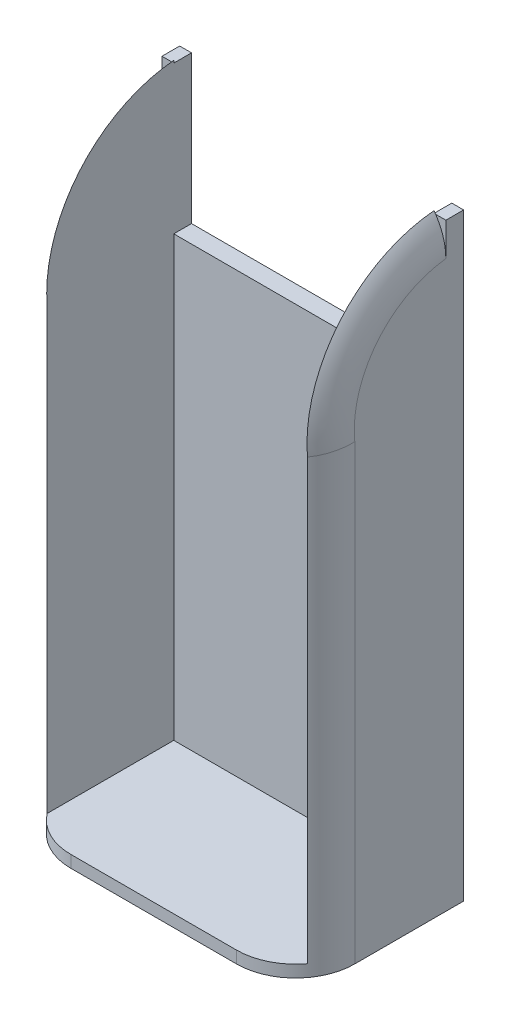
ISO-10303-21;
HEADER;
FILE_DESCRIPTION(('STEP AP214'),'2;1');
FILE_NAME('part.step','',(''),(''),'','','');
FILE_SCHEMA(('AUTOMOTIVE_DESIGN { 1 0 10303 214 1 1 1 1 }'));
ENDSEC;
DATA;
#1=APPLICATION_CONTEXT('core data for automotive mechanical design processes');
#2=APPLICATION_PROTOCOL_DEFINITION('international standard','automotive_design',2000,#1);
#3=PRODUCT_CONTEXT('',#1,'mechanical');
#4=PRODUCT('Part','Part','',(#3));
#5=PRODUCT_RELATED_PRODUCT_CATEGORY('part','',(#4));
#6=PRODUCT_DEFINITION_FORMATION('','',#4);
#7=PRODUCT_DEFINITION_CONTEXT('part definition',#1,'design');
#8=PRODUCT_DEFINITION('design','',#6,#7);
#9=PRODUCT_DEFINITION_SHAPE('','',#8);
#10=(LENGTH_UNIT() NAMED_UNIT(*) SI_UNIT(.MILLI.,.METRE.));
#11=(NAMED_UNIT(*) PLANE_ANGLE_UNIT() SI_UNIT($,.RADIAN.));
#12=(NAMED_UNIT(*) SI_UNIT($,.STERADIAN.) SOLID_ANGLE_UNIT());
#13=UNCERTAINTY_MEASURE_WITH_UNIT(LENGTH_MEASURE(1.E-05),#10,'distance_accuracy_value','');
#14=(GEOMETRIC_REPRESENTATION_CONTEXT(3) GLOBAL_UNCERTAINTY_ASSIGNED_CONTEXT((#13)) GLOBAL_UNIT_ASSIGNED_CONTEXT((#10,
#11,#12)) REPRESENTATION_CONTEXT('',''));
#15=CARTESIAN_POINT('',(0.,0.,0.));
#16=DIRECTION('',(0.,0.,1.));
#17=DIRECTION('',(1.,0.,0.));
#18=AXIS2_PLACEMENT_3D('',#15,#16,#17);
#19=CARTESIAN_POINT('',(-240.,381.,30.));
#20=DIRECTION('',(0.,-1.,0.));
#21=DIRECTION('',(0.,0.,-1.));
#22=AXIS2_PLACEMENT_3D('',#19,#20,#21);
#23=PLANE('',#22);
#24=DIRECTION('',(0.,0.,-1.));
#25=VECTOR('',#24,1.);
#26=CARTESIAN_POINT('',(-220.,381.,30.));
#27=LINE('',#26,#25);
#28=CARTESIAN_POINT('',(-220.,381.,30.));
#29=VERTEX_POINT('',#28);
#30=CARTESIAN_POINT('',(-220.,381.,0.));
#31=VERTEX_POINT('',#30);
#32=EDGE_CURVE('E190',#29,#31,#27,.T.);
#33=ORIENTED_EDGE('',*,*,#32,.F.);
#34=DIRECTION('',(-1.,0.,0.));
#35=VECTOR('',#34,1.);
#36=CARTESIAN_POINT('',(-240.,381.,30.));
#37=LINE('',#36,#35);
#38=CARTESIAN_POINT('',(220.,381.,30.));
#39=VERTEX_POINT('',#38);
#40=EDGE_CURVE('E272',#39,#29,#37,.T.);
#41=ORIENTED_EDGE('',*,*,#40,.F.);
#42=DIRECTION('',(0.,0.,1.));
#43=VECTOR('',#42,1.);
#44=CARTESIAN_POINT('',(220.,381.,30.));
#45=LINE('',#44,#43);
#46=CARTESIAN_POINT('',(220.,381.,0.));
#47=VERTEX_POINT('',#46);
#48=EDGE_CURVE('E196',#47,#39,#45,.T.);
#49=ORIENTED_EDGE('',*,*,#48,.F.);
#50=DIRECTION('',(-1.,0.,0.));
#51=VECTOR('',#50,1.);
#52=CARTESIAN_POINT('',(-240.,381.,0.));
#53=LINE('',#52,#51);
#54=EDGE_CURVE('E63',#47,#31,#53,.T.);
#55=ORIENTED_EDGE('',*,*,#54,.T.);
#56=EDGE_LOOP('',(#33,#41,#49,#55));
#57=FACE_BOUND('',#56,.T.);
#58=ADVANCED_FACE('F41',(#57),#23,.F.);
#59=CARTESIAN_POINT('',(-240.,381.,30.));
#60=DIRECTION('',(0.,0.,-1.));
#61=DIRECTION('',(-1.,0.,0.));
#62=AXIS2_PLACEMENT_3D('',#59,#60,#61);
#63=PLANE('',#62);
#64=DIRECTION('',(0.,1.,0.));
#65=VECTOR('',#64,1.);
#66=CARTESIAN_POINT('',(-220.,381.,30.));
#67=LINE('',#66,#65);
#68=CARTESIAN_POINT('',(-220.,631.,30.));
#69=VERTEX_POINT('',#68);
#70=CARTESIAN_POINT('',(-220.,635.,30.));
#71=VERTEX_POINT('',#70);
#72=EDGE_CURVE('E71',#69,#71,#67,.T.);
#73=ORIENTED_EDGE('',*,*,#72,.F.);
#74=DIRECTION('',(1.,0.,0.));
#75=VECTOR('',#74,1.);
#76=CARTESIAN_POINT('',(-240.,631.,30.));
#77=LINE('',#76,#75);
#78=CARTESIAN_POINT('',(-222.839267238068,631.,30.));
#79=VERTEX_POINT('',#78);
#80=EDGE_CURVE('E179',#79,#69,#77,.T.);
#81=ORIENTED_EDGE('',*,*,#80,.F.);
#82=CARTESIAN_POINT('',(-240.,574.705562742083,30.));
#83=CARTESIAN_POINT('',(-240.000020280491,576.142362169158,30.));
#84=CARTESIAN_POINT('',(-239.969439979918,577.579163111591,30.));
#85=CARTESIAN_POINT('',(-239.847163222499,580.450175370736,30.));
#86=CARTESIAN_POINT('',(-239.755466192061,581.884386663018,30.));
#87=CARTESIAN_POINT('',(-239.511037000242,584.747646559194,30.));
#88=CARTESIAN_POINT('',(-239.358302849601,586.176694993293,30.));
#89=CARTESIAN_POINT('',(-238.992029691078,589.02696651554,30.));
#90=CARTESIAN_POINT('',(-238.77849129379,590.448189682122,30.));
#91=CARTESIAN_POINT('',(-238.297366541693,593.242919170419,30.));
#92=CARTESIAN_POINT('',(-238.031352011091,594.61669629507,30.));
#93=CARTESIAN_POINT('',(-237.442412412851,597.351995150477,30.));
#94=CARTESIAN_POINT('',(-237.119487354624,598.713516883261,30.));
#95=CARTESIAN_POINT('',(-236.41727413445,601.421794038117,30.));
#96=CARTESIAN_POINT('',(-236.03799264115,602.768551187062,30.));
#97=CARTESIAN_POINT('',(-235.223695736805,605.445013326819,30.));
#98=CARTESIAN_POINT('',(-234.788681288006,606.7747186116,30.));
#99=CARTESIAN_POINT('',(-233.49308227483,610.472200543987,30.));
#100=CARTESIAN_POINT('',(-232.570652790497,612.818609725564,30.));
#101=CARTESIAN_POINT('',(-230.552133727895,617.435409995666,30.));
#102=CARTESIAN_POINT('',(-229.456052079012,619.705804549476,30.));
#103=CARTESIAN_POINT('',(-227.6721170205,623.071477675674,30.));
#104=CARTESIAN_POINT('',(-227.045898101025,624.199807914273,30.));
#105=CARTESIAN_POINT('',(-225.750388699596,626.431544996022,30.));
#106=CARTESIAN_POINT('',(-225.081098077271,627.534951757931,30.));
#107=CARTESIAN_POINT('',(-223.700358308921,629.715252311197,30.));
#108=CARTESIAN_POINT('',(-222.988903554594,630.792142548473,30.));
#109=CARTESIAN_POINT('',(-221.524963063522,632.917664226354,30.));
#110=CARTESIAN_POINT('',(-220.772477290741,633.966295642138,30.));
#111=CARTESIAN_POINT('',(-220.,635.,30.));
#112=B_SPLINE_CURVE_WITH_KNOTS('',3,(#82,#83,#84,#85,#86,#87,#88,#89,#90,#91,#92,#93,#94,#95,
#96,#97,#98,#99,#100,#101,#102,#103,#104,#105,#106,#107,#108,#109,#110,#111),.UNSPECIFIED.,.F.,
.F.,(4,2,2,2,2,2,2,2,2,2,2,2,2,2,4),(0.,4.31007532522745,8.62019110195195,12.9304473610946,
17.2406603383697,21.4373390710502,25.6340171096734,29.8301989509514,34.0263083536514,
41.5824344190381,49.1382155524301,53.0087796515271,56.879356365513,60.7504490701866,
64.6215451747219),.UNSPECIFIED.);
#113=EDGE_CURVE('E327',#79,#71,#112,.T.);
#114=ORIENTED_EDGE('',*,*,#113,.T.);
#115=EDGE_LOOP('',(#73,#81,#114));
#116=FACE_BOUND('',#115,.T.);
#117=ADVANCED_FACE('F342',(#116),#63,.T.);
#118=CARTESIAN_POINT('',(240.,381.,30.));
#119=DIRECTION('',(0.,0.,-1.));
#120=DIRECTION('',(-1.,0.,0.));
#121=AXIS2_PLACEMENT_3D('',#118,#119,#120);
#122=PLANE('',#121);
#123=CARTESIAN_POINT('',(220.,635.,30.));
#124=CARTESIAN_POINT('',(220.857755424375,633.852190764845,30.));
#125=CARTESIAN_POINT('',(221.690859428229,632.685963532037,30.));
#126=CARTESIAN_POINT('',(223.306335650478,630.318882056724,30.));
#127=CARTESIAN_POINT('',(224.088707774622,629.118027749896,30.));
#128=CARTESIAN_POINT('',(225.601268718588,626.683936575463,30.));
#129=CARTESIAN_POINT('',(226.331458874878,625.450700538316,30.));
#130=CARTESIAN_POINT('',(227.738369167046,622.954107524872,30.));
#131=CARTESIAN_POINT('',(228.415089729421,621.690750788936,30.));
#132=CARTESIAN_POINT('',(229.696804475589,619.169780841116,30.));
#133=CARTESIAN_POINT('',(230.303215308934,617.912887619245,30.));
#134=CARTESIAN_POINT('',(231.463177652801,615.374943664953,30.));
#135=CARTESIAN_POINT('',(232.016729117383,614.093892911538,30.));
#136=CARTESIAN_POINT('',(233.069996097538,611.509984016349,30.));
#137=CARTESIAN_POINT('',(233.569717171218,610.207128142081,30.));
#138=CARTESIAN_POINT('',(234.514534063232,607.581853427866,30.));
#139=CARTESIAN_POINT('',(234.959630755128,606.259434901147,30.));
#140=CARTESIAN_POINT('',(236.133096129469,602.51742835402,30.));
#141=CARTESIAN_POINT('',(236.798464576711,600.077780997163,30.));
#142=CARTESIAN_POINT('',(237.94402679438,595.155471586427,30.));
#143=CARTESIAN_POINT('',(238.424227247809,592.67281108834,30.));
#144=CARTESIAN_POINT('',(239.008584933453,588.897035403401,30.));
#145=CARTESIAN_POINT('',(239.181922184121,587.614282479737,30.));
#146=CARTESIAN_POINT('',(239.479217004441,585.042996850945,30.));
#147=CARTESIAN_POINT('',(239.603174339445,583.754464118381,30.));
#148=CARTESIAN_POINT('',(239.801552751946,581.173486556949,30.));
#149=CARTESIAN_POINT('',(239.87596919148,579.881041373177,30.));
#150=CARTESIAN_POINT('',(239.975198752932,577.294254012159,30.));
#151=CARTESIAN_POINT('',(240.000012102756,575.999911843655,30.));
#152=CARTESIAN_POINT('',(240.,574.705562742079,30.));
#153=B_SPLINE_CURVE_WITH_KNOTS('',3,(#123,#124,#125,#126,#127,#128,#129,#130,#131,#132,#133,
#134,#135,#136,#137,#138,#139,#140,#141,#142,#143,#144,#145,#146,#147,#148,#149,#150,#151,#152),
.UNSPECIFIED.,.F.,.F.,(4,2,2,2,2,2,2,2,2,2,2,2,2,2,4),(0.,4.29837463856071,8.59675726241606,
12.8950297578605,17.193267964906,21.3786614025203,25.5640584777066,29.7490229863156,
33.9339205595633,41.5126210299785,49.091047947655,52.9734790754705,56.8559286518706,
60.7387416476828,64.6215368034888),.UNSPECIFIED.);
#154=CARTESIAN_POINT('',(220.,635.,30.));
#155=VERTEX_POINT('',#154);
#156=CARTESIAN_POINT('',(222.839267238067,631.,30.));
#157=VERTEX_POINT('',#156);
#158=EDGE_CURVE('E412',#155,#157,#153,.T.);
#159=ORIENTED_EDGE('',*,*,#158,.T.);
#160=DIRECTION('',(1.,0.,0.));
#161=VECTOR('',#160,1.);
#162=CARTESIAN_POINT('',(220.,631.,30.));
#163=LINE('',#162,#161);
#164=CARTESIAN_POINT('',(220.,631.,30.));
#165=VERTEX_POINT('',#164);
#166=EDGE_CURVE('E212',#165,#157,#163,.T.);
#167=ORIENTED_EDGE('',*,*,#166,.F.);
#168=DIRECTION('',(0.,-1.,0.));
#169=VECTOR('',#168,1.);
#170=CARTESIAN_POINT('',(220.,381.,30.));
#171=LINE('',#170,#169);
#172=EDGE_CURVE('E235',#155,#165,#171,.T.);
#173=ORIENTED_EDGE('',*,*,#172,.F.);
#174=EDGE_LOOP('',(#159,#167,#173));
#175=FACE_BOUND('',#174,.T.);
#176=ADVANCED_FACE('F382',(#175),#122,.T.);
#177=CARTESIAN_POINT('',(0.,0.,30.));
#178=DIRECTION('',(0.,0.,-1.));
#179=DIRECTION('',(-1.,0.,0.));
#180=AXIS2_PLACEMENT_3D('',#177,#178,#179);
#181=PLANE('',#180);
#182=ORIENTED_EDGE('',*,*,#40,.T.);
#183=DIRECTION('',(0.,-1.,0.));
#184=VECTOR('',#183,1.);
#185=CARTESIAN_POINT('',(-220.,381.,30.));
#186=LINE('',#185,#184);
#187=CARTESIAN_POINT('',(-220.,-360.64730136677,30.));
#188=VERTEX_POINT('',#187);
#189=EDGE_CURVE('E248',#29,#188,#186,.T.);
#190=ORIENTED_EDGE('',*,*,#189,.T.);
#191=DIRECTION('',(1.,0.,0.));
#192=VECTOR('',#191,1.);
#193=CARTESIAN_POINT('',(-240.,-360.64730136677,30.));
#194=LINE('',#193,#192);
#195=CARTESIAN_POINT('',(220.,-360.64730136677,30.));
#196=VERTEX_POINT('',#195);
#197=EDGE_CURVE('E259',#188,#196,#194,.T.);
#198=ORIENTED_EDGE('',*,*,#197,.T.);
#199=DIRECTION('',(0.,-1.,0.));
#200=VECTOR('',#199,1.);
#201=CARTESIAN_POINT('',(220.,0.,30.));
#202=LINE('',#201,#200);
#203=EDGE_CURVE('E252',#39,#196,#202,.T.);
#204=ORIENTED_EDGE('',*,*,#203,.F.);
#205=EDGE_LOOP('',(#182,#190,#198,#204));
#206=FACE_BOUND('',#205,.T.);
#207=ADVANCED_FACE('F379',(#206),#181,.F.);
#208=CARTESIAN_POINT('',(-240.,-360.64730136677,284.));
#209=DIRECTION('',(0.,1.,0.));
#210=DIRECTION('',(0.,0.,1.));
#211=AXIS2_PLACEMENT_3D('',#208,#209,#210);
#212=PLANE('',#211);
#213=DIRECTION('',(1.,0.,0.));
#214=VECTOR('',#213,1.);
#215=CARTESIAN_POINT('',(-240.,-360.64730136677,284.));
#216=LINE('',#215,#214);
#217=CARTESIAN_POINT('',(-140.,-360.64730136677,284.));
#218=VERTEX_POINT('',#217);
#219=CARTESIAN_POINT('',(140.,-360.64730136677,284.));
#220=VERTEX_POINT('',#219);
#221=EDGE_CURVE('E264',#218,#220,#216,.T.);
#222=ORIENTED_EDGE('',*,*,#221,.T.);
#223=CARTESIAN_POINT('',(140.,-360.64730136677,184.));
#224=DIRECTION('',(0.,1.,0.));
#225=DIRECTION('',(0.,0.,1.));
#226=AXIS2_PLACEMENT_3D('',#223,#224,#225);
#227=CIRCLE('',#226,100.);
#228=CARTESIAN_POINT('',(220.,-360.64730136677,244.));
#229=VERTEX_POINT('',#228);
#230=EDGE_CURVE('E319',#220,#229,#227,.T.);
#231=ORIENTED_EDGE('',*,*,#230,.T.);
#232=DIRECTION('',(0.,0.,-1.));
#233=VECTOR('',#232,1.);
#234=CARTESIAN_POINT('',(220.,-360.64730136677,284.));
#235=LINE('',#234,#233);
#236=EDGE_CURVE('E256',#229,#196,#235,.T.);
#237=ORIENTED_EDGE('',*,*,#236,.T.);
#238=ORIENTED_EDGE('',*,*,#197,.F.);
#239=DIRECTION('',(0.,0.,-1.));
#240=VECTOR('',#239,1.);
#241=CARTESIAN_POINT('',(-220.,-360.64730136677,284.));
#242=LINE('',#241,#240);
#243=CARTESIAN_POINT('',(-220.,-360.64730136677,243.999999999999));
#244=VERTEX_POINT('',#243);
#245=EDGE_CURVE('E245',#244,#188,#242,.T.);
#246=ORIENTED_EDGE('',*,*,#245,.F.);
#247=CARTESIAN_POINT('',(-140.,-360.64730136677,184.));
#248=DIRECTION('',(0.,1.,0.));
#249=DIRECTION('',(0.,0.,1.));
#250=AXIS2_PLACEMENT_3D('',#247,#248,#249);
#251=CIRCLE('',#250,100.);
#252=EDGE_CURVE('E306',#244,#218,#251,.T.);
#253=ORIENTED_EDGE('',*,*,#252,.T.);
#254=EDGE_LOOP('',(#222,#231,#237,#238,#246,#253));
#255=FACE_BOUND('',#254,.T.);
#256=ADVANCED_FACE('F364',(#255),#212,.T.);
#257=CARTESIAN_POINT('',(240.,-381.,30.));
#258=DIRECTION('',(-1.,0.,0.));
#259=DIRECTION('',(0.,0.,1.));
#260=AXIS2_PLACEMENT_3D('',#257,#258,#259);
#261=PLANE('',#260);
#262=DIRECTION('',(0.,1.,0.));
#263=VECTOR('',#262,1.);
#264=CARTESIAN_POINT('',(240.,-381.,0.));
#265=LINE('',#264,#263);
#266=CARTESIAN_POINT('',(240.,-381.,0.));
#267=VERTEX_POINT('',#266);
#268=CARTESIAN_POINT('',(240.,631.,0.));
#269=VERTEX_POINT('',#268);
#270=EDGE_CURVE('E268',#267,#269,#265,.T.);
#271=ORIENTED_EDGE('',*,*,#270,.T.);
#272=DIRECTION('',(0.,0.,-1.));
#273=VECTOR('',#272,1.);
#274=CARTESIAN_POINT('',(240.,631.,30.));
#275=LINE('',#274,#273);
#276=CARTESIAN_POINT('',(240.,631.,30.));
#277=VERTEX_POINT('',#276);
#278=EDGE_CURVE('E216',#277,#269,#275,.T.);
#279=ORIENTED_EDGE('',*,*,#278,.F.);
#280=DIRECTION('',(0.,-1.,0.));
#281=VECTOR('',#280,1.);
#282=CARTESIAN_POINT('',(240.,631.,30.));
#283=LINE('',#282,#281);
#284=CARTESIAN_POINT('',(240.,574.705562742079,30.));
#285=VERTEX_POINT('',#284);
#286=EDGE_CURVE('E227',#277,#285,#283,.T.);
#287=ORIENTED_EDGE('',*,*,#286,.T.);
#288=CARTESIAN_POINT('',(240.,400.999999999854,9.99999999982676));
#289=DIRECTION('',(-1.,0.,0.));
#290=DIRECTION('',(0.,0.,1.));
#291=AXIS2_PLACEMENT_3D('',#288,#289,#290);
#292=CIRCLE('',#291,174.853145603961);
#293=CARTESIAN_POINT('',(240.,383.748260158909,184.));
#294=VERTEX_POINT('',#293);
#295=EDGE_CURVE('E56',#285,#294,#292,.F.);
#296=ORIENTED_EDGE('',*,*,#295,.T.);
#297=DIRECTION('',(0.,-1.,0.));
#298=VECTOR('',#297,1.);
#299=CARTESIAN_POINT('',(240.,-381.,184.));
#300=LINE('',#299,#298);
#301=CARTESIAN_POINT('',(240.,-381.,184.));
#302=VERTEX_POINT('',#301);
#303=EDGE_CURVE('E309',#294,#302,#300,.T.);
#304=ORIENTED_EDGE('',*,*,#303,.T.);
#305=DIRECTION('',(0.,0.,-1.));
#306=VECTOR('',#305,1.);
#307=CARTESIAN_POINT('',(240.,-381.,30.));
#308=LINE('',#307,#306);
#309=EDGE_CURVE('E276',#302,#267,#308,.T.);
#310=ORIENTED_EDGE('',*,*,#309,.T.);
#311=EDGE_LOOP('',(#271,#279,#287,#296,#304,#310));
#312=FACE_BOUND('',#311,.T.);
#313=ADVANCED_FACE('F361',(#312),#261,.F.);
#314=CARTESIAN_POINT('',(-240.,-381.,30.));
#315=DIRECTION('',(1.,0.,0.));
#316=DIRECTION('',(0.,0.,-1.));
#317=AXIS2_PLACEMENT_3D('',#314,#315,#316);
#318=PLANE('',#317);
#319=DIRECTION('',(0.,0.,1.));
#320=VECTOR('',#319,1.);
#321=CARTESIAN_POINT('',(-240.,631.,30.));
#322=LINE('',#321,#320);
#323=CARTESIAN_POINT('',(-240.,631.,0.));
#324=VERTEX_POINT('',#323);
#325=CARTESIAN_POINT('',(-240.,631.,30.));
#326=VERTEX_POINT('',#325);
#327=EDGE_CURVE('E183',#324,#326,#322,.T.);
#328=ORIENTED_EDGE('',*,*,#327,.F.);
#329=DIRECTION('',(0.,-1.,0.));
#330=VECTOR('',#329,1.);
#331=CARTESIAN_POINT('',(-240.,-381.,0.));
#332=LINE('',#331,#330);
#333=CARTESIAN_POINT('',(-240.,-381.,0.));
#334=VERTEX_POINT('',#333);
#335=EDGE_CURVE('E282',#324,#334,#332,.T.);
#336=ORIENTED_EDGE('',*,*,#335,.T.);
#337=DIRECTION('',(0.,0.,-1.));
#338=VECTOR('',#337,1.);
#339=CARTESIAN_POINT('',(-240.,-381.,30.));
#340=LINE('',#339,#338);
#341=CARTESIAN_POINT('',(-240.,-381.,184.));
#342=VERTEX_POINT('',#341);
#343=EDGE_CURVE('E290',#342,#334,#340,.T.);
#344=ORIENTED_EDGE('',*,*,#343,.F.);
#345=DIRECTION('',(0.,-1.,0.));
#346=VECTOR('',#345,1.);
#347=CARTESIAN_POINT('',(-240.,381.,184.));
#348=LINE('',#347,#346);
#349=CARTESIAN_POINT('',(-240.,383.748260158935,184.));
#350=VERTEX_POINT('',#349);
#351=EDGE_CURVE('E300',#342,#350,#348,.F.);
#352=ORIENTED_EDGE('',*,*,#351,.T.);
#353=CARTESIAN_POINT('',(-240.,401.,10.0000000000001));
#354=DIRECTION('',(1.,0.,0.));
#355=DIRECTION('',(0.,0.,-1.));
#356=AXIS2_PLACEMENT_3D('',#353,#354,#355);
#357=CIRCLE('',#356,174.8531456038);
#358=CARTESIAN_POINT('',(-240.,574.705562742083,30.));
#359=VERTEX_POINT('',#358);
#360=EDGE_CURVE('E194',#350,#359,#357,.F.);
#361=ORIENTED_EDGE('',*,*,#360,.T.);
#362=DIRECTION('',(0.,-1.,0.));
#363=VECTOR('',#362,1.);
#364=CARTESIAN_POINT('',(-240.,631.,30.));
#365=LINE('',#364,#363);
#366=EDGE_CURVE('E173',#326,#359,#365,.T.);
#367=ORIENTED_EDGE('',*,*,#366,.F.);
#368=EDGE_LOOP('',(#328,#336,#344,#352,#361,#367));
#369=FACE_BOUND('',#368,.T.);
#370=ADVANCED_FACE('F192',(#369),#318,.F.);
#371=CARTESIAN_POINT('',(-240.,-381.,30.));
#372=DIRECTION('',(0.,1.,0.));
#373=DIRECTION('',(0.,0.,1.));
#374=AXIS2_PLACEMENT_3D('',#371,#372,#373);
#375=PLANE('',#374);
#376=ORIENTED_EDGE('',*,*,#309,.F.);
#377=CARTESIAN_POINT('',(140.,-381.,184.));
#378=DIRECTION('',(0.,1.,0.));
#379=DIRECTION('',(0.,0.,1.));
#380=AXIS2_PLACEMENT_3D('',#377,#378,#379);
#381=CIRCLE('',#380,100.);
#382=CARTESIAN_POINT('',(140.,-381.,284.));
#383=VERTEX_POINT('',#382);
#384=EDGE_CURVE('E313',#302,#383,#381,.F.);
#385=ORIENTED_EDGE('',*,*,#384,.T.);
#386=DIRECTION('',(1.,0.,0.));
#387=VECTOR('',#386,1.);
#388=CARTESIAN_POINT('',(-240.,-381.,284.));
#389=LINE('',#388,#387);
#390=CARTESIAN_POINT('',(-140.,-381.,284.));
#391=VERTEX_POINT('',#390);
#392=EDGE_CURVE('E260',#391,#383,#389,.T.);
#393=ORIENTED_EDGE('',*,*,#392,.F.);
#394=CARTESIAN_POINT('',(-140.,-381.,184.));
#395=DIRECTION('',(0.,1.,0.));
#396=DIRECTION('',(0.,0.,1.));
#397=AXIS2_PLACEMENT_3D('',#394,#395,#396);
#398=CIRCLE('',#397,100.);
#399=EDGE_CURVE('E297',#391,#342,#398,.F.);
#400=ORIENTED_EDGE('',*,*,#399,.T.);
#401=ORIENTED_EDGE('',*,*,#343,.T.);
#402=DIRECTION('',(1.,0.,0.));
#403=VECTOR('',#402,1.);
#404=CARTESIAN_POINT('',(-240.,-381.,0.));
#405=LINE('',#404,#403);
#406=EDGE_CURVE('E277',#334,#267,#405,.T.);
#407=ORIENTED_EDGE('',*,*,#406,.T.);
#408=EDGE_LOOP('',(#376,#385,#393,#400,#401,#407));
#409=FACE_BOUND('',#408,.T.);
#410=ADVANCED_FACE('F370',(#409),#375,.F.);
#411=CARTESIAN_POINT('',(0.,0.,0.));
#412=DIRECTION('',(0.,0.,-1.));
#413=DIRECTION('',(-1.,0.,0.));
#414=AXIS2_PLACEMENT_3D('',#411,#412,#413);
#415=PLANE('',#414);
#416=ORIENTED_EDGE('',*,*,#270,.F.);
#417=ORIENTED_EDGE('',*,*,#406,.F.);
#418=ORIENTED_EDGE('',*,*,#335,.F.);
#419=DIRECTION('',(-1.,0.,0.));
#420=VECTOR('',#419,1.);
#421=CARTESIAN_POINT('',(-240.,631.,0.));
#422=LINE('',#421,#420);
#423=CARTESIAN_POINT('',(-220.,631.,0.));
#424=VERTEX_POINT('',#423);
#425=EDGE_CURVE('E186',#424,#324,#422,.T.);
#426=ORIENTED_EDGE('',*,*,#425,.F.);
#427=DIRECTION('',(0.,-1.,0.));
#428=VECTOR('',#427,1.);
#429=CARTESIAN_POINT('',(-220.,631.,0.));
#430=LINE('',#429,#428);
#431=EDGE_CURVE('E197',#424,#31,#430,.T.);
#432=ORIENTED_EDGE('',*,*,#431,.T.);
#433=ORIENTED_EDGE('',*,*,#54,.F.);
#434=DIRECTION('',(0.,-1.,0.));
#435=VECTOR('',#434,1.);
#436=CARTESIAN_POINT('',(220.,631.,0.));
#437=LINE('',#436,#435);
#438=CARTESIAN_POINT('',(220.,631.,0.));
#439=VERTEX_POINT('',#438);
#440=EDGE_CURVE('E222',#439,#47,#437,.T.);
#441=ORIENTED_EDGE('',*,*,#440,.F.);
#442=DIRECTION('',(-1.,0.,0.));
#443=VECTOR('',#442,1.);
#444=CARTESIAN_POINT('',(220.,631.,0.));
#445=LINE('',#444,#443);
#446=EDGE_CURVE('E220',#269,#439,#445,.T.);
#447=ORIENTED_EDGE('',*,*,#446,.F.);
#448=EDGE_LOOP('',(#416,#417,#418,#426,#432,#433,#441,#447));
#449=FACE_BOUND('',#448,.T.);
#450=ADVANCED_FACE('F373',(#449),#415,.T.);
#451=CARTESIAN_POINT('',(0.,0.,284.));
#452=DIRECTION('',(0.,0.,1.));
#453=DIRECTION('',(1.,0.,0.));
#454=AXIS2_PLACEMENT_3D('',#451,#452,#453);
#455=PLANE('',#454);
#456=ORIENTED_EDGE('',*,*,#392,.T.);
#457=DIRECTION('',(0.,-1.,0.));
#458=VECTOR('',#457,1.);
#459=CARTESIAN_POINT('',(140.,381.,284.));
#460=LINE('',#459,#458);
#461=EDGE_CURVE('E316',#383,#220,#460,.F.);
#462=ORIENTED_EDGE('',*,*,#461,.T.);
#463=ORIENTED_EDGE('',*,*,#221,.F.);
#464=DIRECTION('',(0.,-1.,0.));
#465=VECTOR('',#464,1.);
#466=CARTESIAN_POINT('',(-140.,-381.,284.));
#467=LINE('',#466,#465);
#468=EDGE_CURVE('E293',#218,#391,#467,.T.);
#469=ORIENTED_EDGE('',*,*,#468,.T.);
#470=EDGE_LOOP('',(#456,#462,#463,#469));
#471=FACE_BOUND('',#470,.T.);
#472=ADVANCED_FACE('F377',(#471),#455,.T.);
#473=CARTESIAN_POINT('',(220.,0.,284.));
#474=DIRECTION('',(1.,0.,0.));
#475=DIRECTION('',(0.,1.,0.));
#476=AXIS2_PLACEMENT_3D('',#473,#474,#475);
#477=PLANE('',#476);
#478=ORIENTED_EDGE('',*,*,#236,.F.);
#479=DIRECTION('',(0.,1.,0.));
#480=VECTOR('',#479,1.);
#481=CARTESIAN_POINT('',(220.,-360.64730136677,244.));
#482=LINE('',#481,#480);
#483=CARTESIAN_POINT('',(220.,381.,244.));
#484=VERTEX_POINT('',#483);
#485=EDGE_CURVE('E322',#229,#484,#482,.T.);
#486=ORIENTED_EDGE('',*,*,#485,.T.);
#487=CARTESIAN_POINT('',(220.,400.999999999854,9.99999999982676));
#488=DIRECTION('',(-1.,0.,0.));
#489=DIRECTION('',(0.,1.,0.));
#490=AXIS2_PLACEMENT_3D('',#487,#488,#489);
#491=CIRCLE('',#490,234.853145603961);
#492=EDGE_CURVE('E231',#484,#155,#491,.T.);
#493=ORIENTED_EDGE('',*,*,#492,.T.);
#494=ORIENTED_EDGE('',*,*,#172,.T.);
#495=DIRECTION('',(0.,0.,1.));
#496=VECTOR('',#495,1.);
#497=CARTESIAN_POINT('',(220.,631.,30.));
#498=LINE('',#497,#496);
#499=EDGE_CURVE('E202',#439,#165,#498,.T.);
#500=ORIENTED_EDGE('',*,*,#499,.F.);
#501=ORIENTED_EDGE('',*,*,#440,.T.);
#502=ORIENTED_EDGE('',*,*,#48,.T.);
#503=ORIENTED_EDGE('',*,*,#203,.T.);
#504=EDGE_LOOP('',(#478,#486,#493,#494,#500,#501,#502,#503));
#505=FACE_BOUND('',#504,.T.);
#506=ADVANCED_FACE('F389',(#505),#477,.F.);
#507=CARTESIAN_POINT('',(-220.,381.,284.));
#508=DIRECTION('',(1.,0.,0.));
#509=DIRECTION('',(0.,1.,0.));
#510=AXIS2_PLACEMENT_3D('',#507,#508,#509);
#511=PLANE('',#510);
#512=ORIENTED_EDGE('',*,*,#189,.F.);
#513=ORIENTED_EDGE('',*,*,#32,.T.);
#514=ORIENTED_EDGE('',*,*,#431,.F.);
#515=DIRECTION('',(0.,0.,-1.));
#516=VECTOR('',#515,1.);
#517=CARTESIAN_POINT('',(-220.,631.,30.));
#518=LINE('',#517,#516);
#519=EDGE_CURVE('E178',#69,#424,#518,.T.);
#520=ORIENTED_EDGE('',*,*,#519,.F.);
#521=ORIENTED_EDGE('',*,*,#72,.T.);
#522=CARTESIAN_POINT('',(-220.,401.,10.0000000000001));
#523=DIRECTION('',(1.,0.,0.));
#524=DIRECTION('',(0.,1.,0.));
#525=AXIS2_PLACEMENT_3D('',#522,#523,#524);
#526=CIRCLE('',#525,234.8531456038);
#527=CARTESIAN_POINT('',(-220.,381.,244.));
#528=VERTEX_POINT('',#527);
#529=EDGE_CURVE('E241',#71,#528,#526,.T.);
#530=ORIENTED_EDGE('',*,*,#529,.T.);
#531=DIRECTION('',(0.,1.,0.));
#532=VECTOR('',#531,1.);
#533=CARTESIAN_POINT('',(-220.,381.,244.));
#534=LINE('',#533,#532);
#535=EDGE_CURVE('E303',#528,#244,#534,.F.);
#536=ORIENTED_EDGE('',*,*,#535,.T.);
#537=ORIENTED_EDGE('',*,*,#245,.T.);
#538=EDGE_LOOP('',(#512,#513,#514,#520,#521,#530,#536,#537));
#539=FACE_BOUND('',#538,.T.);
#540=ADVANCED_FACE('F359',(#539),#511,.T.);
#541=CARTESIAN_POINT('',(-140.,0.,184.));
#542=DIRECTION('',(0.,1.,0.));
#543=DIRECTION('',(0.,0.,1.));
#544=AXIS2_PLACEMENT_3D('',#541,#542,#543);
#545=CYLINDRICAL_SURFACE('',#544,100.);
#546=ORIENTED_EDGE('',*,*,#535,.F.);
#547=CARTESIAN_POINT('',(-220.,381.,244.));
#548=CARTESIAN_POINT('',(-220.843533954754,381.047975814701,242.875319585943));
#549=CARTESIAN_POINT('',(-221.663300610922,381.096882834841,241.732855640136));
#550=CARTESIAN_POINT('',(-223.253914954777,381.196510608876,239.414446625808));
#551=CARTESIAN_POINT('',(-224.024762745236,381.24723135896,238.238501627634));
#552=CARTESIAN_POINT('',(-225.516223749223,381.350442630157,235.855107503868));
#553=CARTESIAN_POINT('',(-226.236832564146,381.402933305638,234.647655632421));
#554=CARTESIAN_POINT('',(-227.626470402878,381.509628285804,232.203504610629));
#555=CARTESIAN_POINT('',(-228.295499527887,381.563832587126,230.966805517673));
#556=CARTESIAN_POINT('',(-229.581660133829,381.673974736348,228.46467743136));
#557=CARTESIAN_POINT('',(-230.198720657284,381.729914816179,227.199212059596));
#558=CARTESIAN_POINT('',(-231.378846601781,381.843401689416,224.643420701311));
#559=CARTESIAN_POINT('',(-231.941911826318,381.900948488667,223.353094624335));
#560=CARTESIAN_POINT('',(-233.012976020787,382.017581186618,220.750055517801));
#561=CARTESIAN_POINT('',(-233.520982997973,382.076666859962,219.437345775779));
#562=CARTESIAN_POINT('',(-234.481097589678,382.19631725884,216.791809976704));
#563=CARTESIAN_POINT('',(-234.933206298015,382.256881955405,215.458984313854));
#564=CARTESIAN_POINT('',(-236.120872466361,382.428611025566,211.698535247248));
#565=CARTESIAN_POINT('',(-236.792782993296,382.541382474406,209.250575414552));
#566=CARTESIAN_POINT('',(-237.948544090755,382.771137614427,204.310543157997));
#567=CARTESIAN_POINT('',(-238.432374625608,382.888121752924,201.818466063992));
#568=CARTESIAN_POINT('',(-239.014415998358,383.066224367734,198.062232926643));
#569=CARTESIAN_POINT('',(-239.184352968859,383.125951476845,196.808752463001));
#570=CARTESIAN_POINT('',(-239.476553694552,383.246277631992,194.29631546052));
#571=CARTESIAN_POINT('',(-239.598821051962,383.306876611786,193.037359342728));
#572=CARTESIAN_POINT('',(-239.795464295978,383.42885612731,190.516385245711));
#573=CARTESIAN_POINT('',(-239.869862802857,383.490236279894,189.254368995963));
#574=CARTESIAN_POINT('',(-239.970755274357,383.613738753894,186.728573231629));
#575=CARTESIAN_POINT('',(-239.997256146295,383.675860966996,185.464793997594));
#576=CARTESIAN_POINT('',(-239.999932612392,383.741631042891,184.134068865163));
#577=CARTESIAN_POINT('',(-240.000000017863,383.744945133012,184.067034228155));
#578=CARTESIAN_POINT('',(-240.,383.748260158935,184.));
#579=B_SPLINE_CURVE_WITH_KNOTS('',3,(#547,#548,#549,#550,#551,#552,#553,#554,#555,#556,#557,
#558,#559,#560,#561,#562,#563,#564,#565,#566,#567,#568,#569,#570,#571,#572,#573,#574,#575,#576,
#577,#578),.UNSPECIFIED.,.F.,.F.,(4,2,2,2,2,2,2,2,2,2,2,2,2,2,2,4),(0.,4.21973354428668,
8.43945822311794,12.6595518914844,16.8796372799252,21.1053943494322,25.3311667971449,
29.556323853462,33.7813982187956,41.396652534009,49.0127178602276,52.8110341571037,
56.6090633735364,60.4052965226004,64.2009821731679,64.4023316425322),.UNSPECIFIED.);
#580=EDGE_CURVE('E335',#528,#350,#579,.T.);
#581=ORIENTED_EDGE('',*,*,#580,.T.);
#582=ORIENTED_EDGE('',*,*,#351,.F.);
#583=ORIENTED_EDGE('',*,*,#399,.F.);
#584=ORIENTED_EDGE('',*,*,#468,.F.);
#585=ORIENTED_EDGE('',*,*,#252,.F.);
#586=EDGE_LOOP('',(#546,#581,#582,#583,#584,#585));
#587=FACE_BOUND('',#586,.T.);
#588=ADVANCED_FACE('F354',(#587),#545,.T.);
#589=CARTESIAN_POINT('',(140.,-381.,184.));
#590=DIRECTION('',(0.,1.,0.));
#591=DIRECTION('',(0.,0.,1.));
#592=AXIS2_PLACEMENT_3D('',#589,#590,#591);
#593=CYLINDRICAL_SURFACE('',#592,100.);
#594=ORIENTED_EDGE('',*,*,#230,.F.);
#595=ORIENTED_EDGE('',*,*,#461,.F.);
#596=ORIENTED_EDGE('',*,*,#384,.F.);
#597=ORIENTED_EDGE('',*,*,#303,.F.);
#598=CARTESIAN_POINT('',(220.,381.,244.));
#599=CARTESIAN_POINT('',(220.843533954754,381.047975814697,242.875319585944));
#600=CARTESIAN_POINT('',(221.663300610921,381.096882834837,241.732855640138));
#601=CARTESIAN_POINT('',(223.253914954775,381.196510608871,239.414446625811));
#602=CARTESIAN_POINT('',(224.024762745233,381.247231358954,238.238501627638));
#603=CARTESIAN_POINT('',(225.51622374922,381.35044263015,235.855107503874));
#604=CARTESIAN_POINT('',(226.236832564142,381.402933305631,234.647655632427));
#605=CARTESIAN_POINT('',(227.626470402874,381.509628285796,232.203504610637));
#606=CARTESIAN_POINT('',(228.295499527882,381.563832587118,230.966805517682));
#607=CARTESIAN_POINT('',(229.581660133825,381.673974736338,228.464677431369));
#608=CARTESIAN_POINT('',(230.19872065728,381.72991481617,227.199212059604));
#609=CARTESIAN_POINT('',(231.378846601778,381.843401689405,224.643420701317));
#610=CARTESIAN_POINT('',(231.941911826316,381.900948488655,223.35309462434));
#611=CARTESIAN_POINT('',(233.012976020785,382.017581186606,220.750055517805));
#612=CARTESIAN_POINT('',(233.520982997972,382.07666685995,219.437345775782));
#613=CARTESIAN_POINT('',(234.481097589678,382.196317258827,216.791809976706));
#614=CARTESIAN_POINT('',(234.933206298015,382.256881955391,215.458984313855));
#615=CARTESIAN_POINT('',(236.120872466362,382.428611025552,211.698535247248));
#616=CARTESIAN_POINT('',(236.792782993296,382.541382474392,209.250575414552));
#617=CARTESIAN_POINT('',(237.948544090755,382.771137614407,204.310543157996));
#618=CARTESIAN_POINT('',(238.432374625608,382.888121752899,201.818466063989));
#619=CARTESIAN_POINT('',(239.014415998358,383.066224367717,198.06223292664));
#620=CARTESIAN_POINT('',(239.184352968859,383.125951476833,196.808752462999));
#621=CARTESIAN_POINT('',(239.476553694553,383.246277631962,194.296315460517));
#622=CARTESIAN_POINT('',(239.598821051962,383.306876611732,193.037359342724));
#623=CARTESIAN_POINT('',(239.795464295978,383.428856127318,190.516385245711));
#624=CARTESIAN_POINT('',(239.869862802857,383.490236279988,189.254368995968));
#625=CARTESIAN_POINT('',(239.970755274357,383.613738753747,186.728573231623));
#626=CARTESIAN_POINT('',(239.997256146295,383.675860966522,185.464793997572));
#627=CARTESIAN_POINT('',(239.999932612392,383.741631042819,184.134068865162));
#628=CARTESIAN_POINT('',(240.000000017863,383.744945132963,184.067034228154));
#629=CARTESIAN_POINT('',(240.,383.748260158909,184.));
#630=B_SPLINE_CURVE_WITH_KNOTS('',3,(#598,#599,#600,#601,#602,#603,#604,#605,#606,#607,#608,
#609,#610,#611,#612,#613,#614,#615,#616,#617,#618,#619,#620,#621,#622,#623,#624,#625,#626,#627,
#628,#629),.UNSPECIFIED.,.F.,.F.,(4,2,2,2,2,2,2,2,2,2,2,2,2,2,2,4),(0.,4.21973354428369,
8.43945822311201,12.6595518914759,16.8796372799142,21.1053943494239,25.3311667971394,
29.5563238534589,33.7813982187949,41.3966525340092,49.01271786023,52.8110341571055,
56.6090633735375,60.4052965226002,64.200982173166,64.4023316425314),.UNSPECIFIED.);
#631=EDGE_CURVE('E11',#294,#484,#630,.F.);
#632=ORIENTED_EDGE('',*,*,#631,.T.);
#633=ORIENTED_EDGE('',*,*,#485,.F.);
#634=EDGE_LOOP('',(#594,#595,#596,#597,#632,#633));
#635=FACE_BOUND('',#634,.T.);
#636=ADVANCED_FACE('F349',(#635),#593,.T.);
#637=CARTESIAN_POINT('',(-140.,401.,10.0000000000001));
#638=DIRECTION('',(-1.,0.,0.));
#639=DIRECTION('',(0.,0.,1.));
#640=AXIS2_PLACEMENT_3D('',#637,#638,#639);
#641=TOROIDAL_SURFACE('',#640,174.8531456038,100.);
#642=EDGE_CURVE('E175',#359,#79,#112,.T.);
#643=ORIENTED_EDGE('',*,*,#642,.F.);
#644=ORIENTED_EDGE('',*,*,#360,.F.);
#645=ORIENTED_EDGE('',*,*,#580,.F.);
#646=ORIENTED_EDGE('',*,*,#529,.F.);
#647=ORIENTED_EDGE('',*,*,#113,.F.);
#648=EDGE_LOOP('',(#643,#644,#645,#646,#647));
#649=FACE_BOUND('',#648,.T.);
#650=ADVANCED_FACE('F346',(#649),#641,.T.);
#651=CARTESIAN_POINT('',(140.,400.999999999854,9.99999999982676));
#652=DIRECTION('',(1.,0.,0.));
#653=DIRECTION('',(0.,0.,-1.));
#654=AXIS2_PLACEMENT_3D('',#651,#652,#653);
#655=TOROIDAL_SURFACE('',#654,174.853145603961,100.);
#656=ORIENTED_EDGE('',*,*,#631,.F.);
#657=ORIENTED_EDGE('',*,*,#295,.F.);
#658=EDGE_CURVE('E445',#157,#285,#153,.T.);
#659=ORIENTED_EDGE('',*,*,#658,.F.);
#660=ORIENTED_EDGE('',*,*,#158,.F.);
#661=ORIENTED_EDGE('',*,*,#492,.F.);
#662=EDGE_LOOP('',(#656,#657,#659,#660,#661));
#663=FACE_BOUND('',#662,.T.);
#664=ADVANCED_FACE('F43',(#663),#655,.T.);
#665=CARTESIAN_POINT('',(220.,631.,30.));
#666=DIRECTION('',(0.,0.,-1.));
#667=DIRECTION('',(-1.,0.,0.));
#668=AXIS2_PLACEMENT_3D('',#665,#666,#667);
#669=PLANE('',#668);
#670=ORIENTED_EDGE('',*,*,#658,.T.);
#671=ORIENTED_EDGE('',*,*,#286,.F.);
#672=EDGE_CURVE('E211',#157,#277,#163,.T.);
#673=ORIENTED_EDGE('',*,*,#672,.F.);
#674=EDGE_LOOP('',(#670,#671,#673));
#675=FACE_BOUND('',#674,.T.);
#676=ADVANCED_FACE('F444',(#675),#669,.F.);
#677=CARTESIAN_POINT('',(0.,631.,0.));
#678=DIRECTION('',(0.,-1.,0.));
#679=DIRECTION('',(0.,0.,-1.));
#680=AXIS2_PLACEMENT_3D('',#677,#678,#679);
#681=PLANE('',#680);
#682=ORIENTED_EDGE('',*,*,#499,.T.);
#683=ORIENTED_EDGE('',*,*,#166,.T.);
#684=ORIENTED_EDGE('',*,*,#672,.T.);
#685=ORIENTED_EDGE('',*,*,#278,.T.);
#686=ORIENTED_EDGE('',*,*,#446,.T.);
#687=EDGE_LOOP('',(#682,#683,#684,#685,#686));
#688=FACE_BOUND('',#687,.T.);
#689=ADVANCED_FACE('F418',(#688),#681,.F.);
#690=CARTESIAN_POINT('',(-240.,631.,30.));
#691=DIRECTION('',(0.,0.,-1.));
#692=DIRECTION('',(-1.,0.,0.));
#693=AXIS2_PLACEMENT_3D('',#690,#691,#692);
#694=PLANE('',#693);
#695=ORIENTED_EDGE('',*,*,#642,.T.);
#696=EDGE_CURVE('E169',#326,#79,#77,.T.);
#697=ORIENTED_EDGE('',*,*,#696,.F.);
#698=ORIENTED_EDGE('',*,*,#366,.T.);
#699=EDGE_LOOP('',(#695,#697,#698));
#700=FACE_BOUND('',#699,.T.);
#701=ADVANCED_FACE('F171',(#700),#694,.F.);
#702=CARTESIAN_POINT('',(0.,631.,0.));
#703=DIRECTION('',(0.,-1.,0.));
#704=DIRECTION('',(0.,0.,-1.));
#705=AXIS2_PLACEMENT_3D('',#702,#703,#704);
#706=PLANE('',#705);
#707=ORIENTED_EDGE('',*,*,#327,.T.);
#708=ORIENTED_EDGE('',*,*,#696,.T.);
#709=ORIENTED_EDGE('',*,*,#80,.T.);
#710=ORIENTED_EDGE('',*,*,#519,.T.);
#711=ORIENTED_EDGE('',*,*,#425,.T.);
#712=EDGE_LOOP('',(#707,#708,#709,#710,#711));
#713=FACE_BOUND('',#712,.T.);
#714=ADVANCED_FACE('F184',(#713),#706,.F.);
#715=CLOSED_SHELL('',(#58,#117,#176,#207,#256,#313,#370,#410,#450,#472,#506,#540,#588,#636,#650,
#664,#676,#689,#701,#714));
#716=MANIFOLD_SOLID_BREP('B2',#715);
#717=ADVANCED_BREP_SHAPE_REPRESENTATION('',(#18,#716),#14);
#718=SHAPE_DEFINITION_REPRESENTATION(#9,#717);
ENDSEC;
END-ISO-10303-21;
